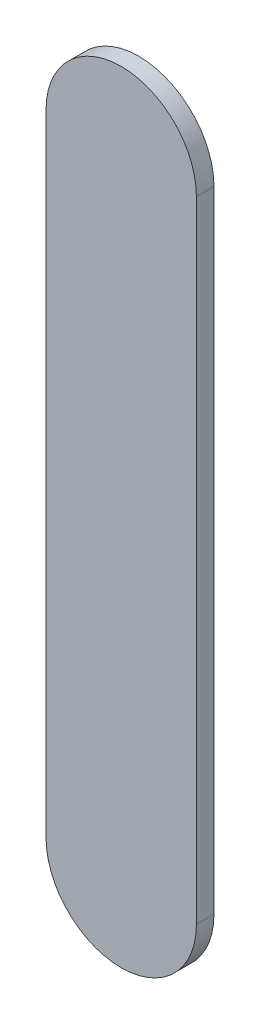
ISO-10303-21;
HEADER;
FILE_DESCRIPTION(('STEP AP214'),'2;1');
FILE_NAME('part.step','',(''),(''),'','','');
FILE_SCHEMA(('AUTOMOTIVE_DESIGN { 1 0 10303 214 1 1 1 1 }'));
ENDSEC;
DATA;
#1=APPLICATION_CONTEXT('core data for automotive mechanical design processes');
#2=APPLICATION_PROTOCOL_DEFINITION('international standard','automotive_design',2000,#1);
#3=PRODUCT_CONTEXT('',#1,'mechanical');
#4=PRODUCT('Part','Part','',(#3));
#5=PRODUCT_RELATED_PRODUCT_CATEGORY('part','',(#4));
#6=PRODUCT_DEFINITION_FORMATION('','',#4);
#7=PRODUCT_DEFINITION_CONTEXT('part definition',#1,'design');
#8=PRODUCT_DEFINITION('design','',#6,#7);
#9=PRODUCT_DEFINITION_SHAPE('','',#8);
#10=(LENGTH_UNIT() NAMED_UNIT(*) SI_UNIT(.MILLI.,.METRE.));
#11=(NAMED_UNIT(*) PLANE_ANGLE_UNIT() SI_UNIT($,.RADIAN.));
#12=(NAMED_UNIT(*) SI_UNIT($,.STERADIAN.) SOLID_ANGLE_UNIT());
#13=UNCERTAINTY_MEASURE_WITH_UNIT(LENGTH_MEASURE(1.E-05),#10,'distance_accuracy_value','');
#14=(GEOMETRIC_REPRESENTATION_CONTEXT(3) GLOBAL_UNCERTAINTY_ASSIGNED_CONTEXT((#13)) GLOBAL_UNIT_ASSIGNED_CONTEXT((#10,
#11,#12)) REPRESENTATION_CONTEXT('',''));
#15=CARTESIAN_POINT('',(0.,0.,0.));
#16=DIRECTION('',(0.,0.,1.));
#17=DIRECTION('',(1.,0.,0.));
#18=AXIS2_PLACEMENT_3D('',#15,#16,#17);
#19=CARTESIAN_POINT('',(126.150001,-61.5875,1.635));
#20=DIRECTION('',(0.,0.,1.));
#21=DIRECTION('',(1.,0.,0.));
#22=AXIS2_PLACEMENT_3D('',#19,#20,#21);
#23=PLANE('',#22);
#24=DIRECTION('',(0.,1.,0.));
#25=VECTOR('',#24,1.);
#26=CARTESIAN_POINT('',(126.150001,-61.5875,1.635));
#27=LINE('',#26,#25);
#28=CARTESIAN_POINT('',(126.150001,-61.5875,1.635));
#29=VERTEX_POINT('',#28);
#30=CARTESIAN_POINT('',(126.150001,-60.329999,1.635));
#31=VERTEX_POINT('',#30);
#32=EDGE_CURVE('E84',#29,#31,#27,.T.);
#33=ORIENTED_EDGE('',*,*,#32,.T.);
#34=CARTESIAN_POINT('',(126.000001,-60.329999,1.635));
#35=DIRECTION('',(0.,0.,1.));
#36=DIRECTION('',(1.,0.,0.));
#37=AXIS2_PLACEMENT_3D('',#34,#35,#36);
#38=CIRCLE('',#37,0.15);
#39=CARTESIAN_POINT('',(125.850001,-60.329999,1.635));
#40=VERTEX_POINT('',#39);
#41=EDGE_CURVE('E99',#31,#40,#38,.T.);
#42=ORIENTED_EDGE('',*,*,#41,.T.);
#43=DIRECTION('',(0.,-1.,0.));
#44=VECTOR('',#43,1.);
#45=CARTESIAN_POINT('',(125.850001,-60.329999,1.635));
#46=LINE('',#45,#44);
#47=CARTESIAN_POINT('',(125.850001,-61.5875,1.635));
#48=VERTEX_POINT('',#47);
#49=EDGE_CURVE('E76',#40,#48,#46,.T.);
#50=ORIENTED_EDGE('',*,*,#49,.T.);
#51=CARTESIAN_POINT('',(126.000001,-61.5875,1.635));
#52=DIRECTION('',(0.,0.,1.));
#53=DIRECTION('',(-1.,0.,0.));
#54=AXIS2_PLACEMENT_3D('',#51,#52,#53);
#55=CIRCLE('',#54,0.15);
#56=EDGE_CURVE('E11',#48,#29,#55,.T.);
#57=ORIENTED_EDGE('',*,*,#56,.T.);
#58=EDGE_LOOP('',(#33,#42,#50,#57));
#59=FACE_BOUND('',#58,.T.);
#60=ADVANCED_FACE('F17',(#59),#23,.T.);
#61=CARTESIAN_POINT('',(126.150001,-61.5875,1.6));
#62=DIRECTION('',(0.,0.,1.));
#63=DIRECTION('',(1.,0.,0.));
#64=AXIS2_PLACEMENT_3D('',#61,#62,#63);
#65=PLANE('',#64);
#66=CARTESIAN_POINT('',(126.000001,-61.5875,1.6));
#67=DIRECTION('',(0.,0.,1.));
#68=DIRECTION('',(-1.,0.,0.));
#69=AXIS2_PLACEMENT_3D('',#66,#67,#68);
#70=CIRCLE('',#69,0.15);
#71=CARTESIAN_POINT('',(125.850001,-61.5875,1.6));
#72=VERTEX_POINT('',#71);
#73=CARTESIAN_POINT('',(126.150001,-61.5875,1.6));
#74=VERTEX_POINT('',#73);
#75=EDGE_CURVE('E27',#72,#74,#70,.T.);
#76=ORIENTED_EDGE('',*,*,#75,.F.);
#77=DIRECTION('',(0.,-1.,0.));
#78=VECTOR('',#77,1.);
#79=CARTESIAN_POINT('',(125.850001,-60.329999,1.6));
#80=LINE('',#79,#78);
#81=CARTESIAN_POINT('',(125.850001,-60.329999,1.6));
#82=VERTEX_POINT('',#81);
#83=EDGE_CURVE('E102',#82,#72,#80,.T.);
#84=ORIENTED_EDGE('',*,*,#83,.F.);
#85=CARTESIAN_POINT('',(126.000001,-60.329999,1.6));
#86=DIRECTION('',(0.,0.,1.));
#87=DIRECTION('',(1.,0.,0.));
#88=AXIS2_PLACEMENT_3D('',#85,#86,#87);
#89=CIRCLE('',#88,0.15);
#90=CARTESIAN_POINT('',(126.150001,-60.329999,1.6));
#91=VERTEX_POINT('',#90);
#92=EDGE_CURVE('E86',#91,#82,#89,.T.);
#93=ORIENTED_EDGE('',*,*,#92,.F.);
#94=DIRECTION('',(0.,1.,0.));
#95=VECTOR('',#94,1.);
#96=CARTESIAN_POINT('',(126.150001,-61.5875,1.6));
#97=LINE('',#96,#95);
#98=EDGE_CURVE('E82',#74,#91,#97,.T.);
#99=ORIENTED_EDGE('',*,*,#98,.F.);
#100=EDGE_LOOP('',(#76,#84,#93,#99));
#101=FACE_BOUND('',#100,.T.);
#102=ADVANCED_FACE('F19',(#101),#65,.F.);
#103=CARTESIAN_POINT('',(126.000001,-61.5875,1.6));
#104=DIRECTION('',(0.,0.,-1.));
#105=DIRECTION('',(-1.,0.,0.));
#106=AXIS2_PLACEMENT_3D('',#103,#104,#105);
#107=CYLINDRICAL_SURFACE('',#106,0.15);
#108=ORIENTED_EDGE('',*,*,#75,.T.);
#109=DIRECTION('',(0.,0.,1.));
#110=VECTOR('',#109,1.);
#111=CARTESIAN_POINT('',(126.150001,-61.5875,1.6));
#112=LINE('',#111,#110);
#113=EDGE_CURVE('E71',#74,#29,#112,.T.);
#114=ORIENTED_EDGE('',*,*,#113,.T.);
#115=ORIENTED_EDGE('',*,*,#56,.F.);
#116=DIRECTION('',(0.,0.,1.));
#117=VECTOR('',#116,1.);
#118=CARTESIAN_POINT('',(125.850001,-61.5875,1.6));
#119=LINE('',#118,#117);
#120=EDGE_CURVE('E21',#72,#48,#119,.T.);
#121=ORIENTED_EDGE('',*,*,#120,.F.);
#122=EDGE_LOOP('',(#108,#114,#115,#121));
#123=FACE_BOUND('',#122,.T.);
#124=ADVANCED_FACE('F70',(#123),#107,.T.);
#125=CARTESIAN_POINT('',(125.850001,-60.329999,1.6));
#126=DIRECTION('',(1.,0.,0.));
#127=DIRECTION('',(0.,1.,0.));
#128=AXIS2_PLACEMENT_3D('',#125,#126,#127);
#129=PLANE('',#128);
#130=ORIENTED_EDGE('',*,*,#83,.T.);
#131=ORIENTED_EDGE('',*,*,#120,.T.);
#132=ORIENTED_EDGE('',*,*,#49,.F.);
#133=DIRECTION('',(0.,0.,1.));
#134=VECTOR('',#133,1.);
#135=CARTESIAN_POINT('',(125.850001,-60.329999,1.6));
#136=LINE('',#135,#134);
#137=EDGE_CURVE('E103',#82,#40,#136,.T.);
#138=ORIENTED_EDGE('',*,*,#137,.F.);
#139=EDGE_LOOP('',(#130,#131,#132,#138));
#140=FACE_BOUND('',#139,.T.);
#141=ADVANCED_FACE('F121',(#140),#129,.F.);
#142=CARTESIAN_POINT('',(126.000001,-60.329999,1.6));
#143=DIRECTION('',(0.,0.,-1.));
#144=DIRECTION('',(1.,0.,0.));
#145=AXIS2_PLACEMENT_3D('',#142,#143,#144);
#146=CYLINDRICAL_SURFACE('',#145,0.15);
#147=ORIENTED_EDGE('',*,*,#92,.T.);
#148=ORIENTED_EDGE('',*,*,#137,.T.);
#149=ORIENTED_EDGE('',*,*,#41,.F.);
#150=DIRECTION('',(0.,0.,1.));
#151=VECTOR('',#150,1.);
#152=CARTESIAN_POINT('',(126.150001,-60.329999,1.6));
#153=LINE('',#152,#151);
#154=EDGE_CURVE('E91',#91,#31,#153,.T.);
#155=ORIENTED_EDGE('',*,*,#154,.F.);
#156=EDGE_LOOP('',(#147,#148,#149,#155));
#157=FACE_BOUND('',#156,.T.);
#158=ADVANCED_FACE('F124',(#157),#146,.T.);
#159=CARTESIAN_POINT('',(126.150001,-61.5875,1.6));
#160=DIRECTION('',(-1.,0.,0.));
#161=DIRECTION('',(0.,0.,1.));
#162=AXIS2_PLACEMENT_3D('',#159,#160,#161);
#163=PLANE('',#162);
#164=ORIENTED_EDGE('',*,*,#98,.T.);
#165=ORIENTED_EDGE('',*,*,#154,.T.);
#166=ORIENTED_EDGE('',*,*,#32,.F.);
#167=ORIENTED_EDGE('',*,*,#113,.F.);
#168=EDGE_LOOP('',(#164,#165,#166,#167));
#169=FACE_BOUND('',#168,.T.);
#170=ADVANCED_FACE('F80',(#169),#163,.F.);
#171=CLOSED_SHELL('',(#60,#102,#124,#141,#158,#170));
#172=MANIFOLD_SOLID_BREP('B1',#171);
#173=ADVANCED_BREP_SHAPE_REPRESENTATION('',(#18,#172),#14);
#174=SHAPE_DEFINITION_REPRESENTATION(#9,#173);
ENDSEC;
END-ISO-10303-21;
